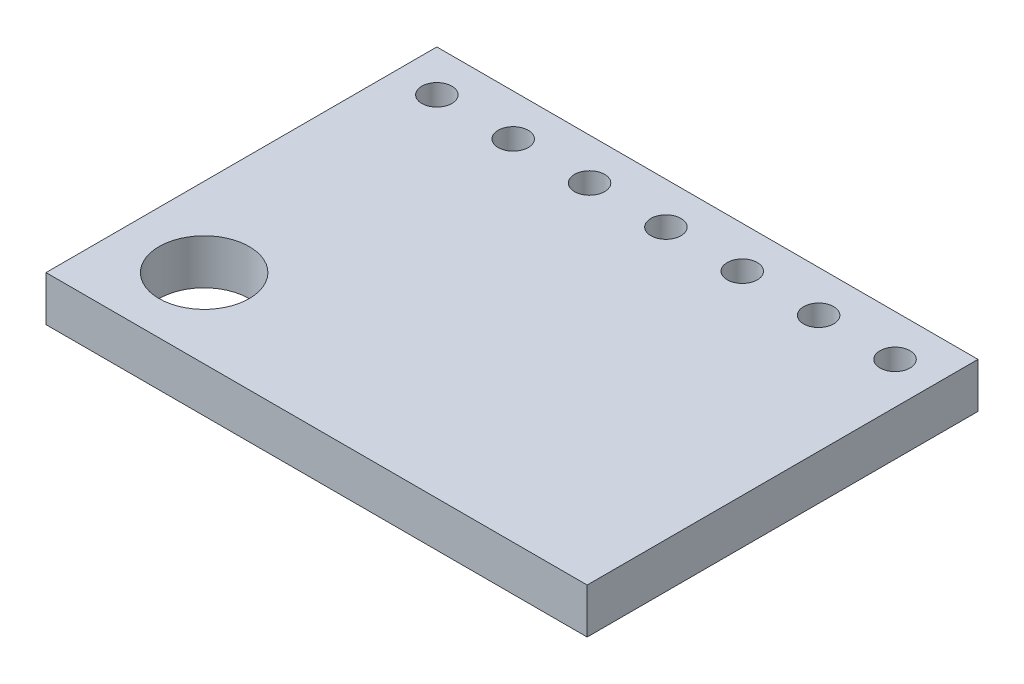
ISO-10303-21;
HEADER;
FILE_DESCRIPTION(('STEP AP214'),'2;1');
FILE_NAME('part.step','',(''),(''),'','','');
FILE_SCHEMA(('AUTOMOTIVE_DESIGN { 1 0 10303 214 1 1 1 1 }'));
ENDSEC;
DATA;
#1=APPLICATION_CONTEXT('core data for automotive mechanical design processes');
#2=APPLICATION_PROTOCOL_DEFINITION('international standard','automotive_design',2000,#1);
#3=PRODUCT_CONTEXT('',#1,'mechanical');
#4=PRODUCT('Part','Part','',(#3));
#5=PRODUCT_RELATED_PRODUCT_CATEGORY('part','',(#4));
#6=PRODUCT_DEFINITION_FORMATION('','',#4);
#7=PRODUCT_DEFINITION_CONTEXT('part definition',#1,'design');
#8=PRODUCT_DEFINITION('design','',#6,#7);
#9=PRODUCT_DEFINITION_SHAPE('','',#8);
#10=(LENGTH_UNIT() NAMED_UNIT(*) SI_UNIT(.MILLI.,.METRE.));
#11=(NAMED_UNIT(*) PLANE_ANGLE_UNIT() SI_UNIT($,.RADIAN.));
#12=(NAMED_UNIT(*) SI_UNIT($,.STERADIAN.) SOLID_ANGLE_UNIT());
#13=UNCERTAINTY_MEASURE_WITH_UNIT(LENGTH_MEASURE(1.E-05),#10,'distance_accuracy_value','');
#14=(GEOMETRIC_REPRESENTATION_CONTEXT(3) GLOBAL_UNCERTAINTY_ASSIGNED_CONTEXT((#13)) GLOBAL_UNIT_ASSIGNED_CONTEXT((#10,
#11,#12)) REPRESENTATION_CONTEXT('',''));
#15=CARTESIAN_POINT('',(0.,0.,0.));
#16=DIRECTION('',(0.,0.,1.));
#17=DIRECTION('',(1.,0.,0.));
#18=AXIS2_PLACEMENT_3D('',#15,#16,#17);
#19=CARTESIAN_POINT('',(0.,-1.5,0.));
#20=DIRECTION('',(-1.,0.,0.));
#21=DIRECTION('',(0.,0.,1.));
#22=AXIS2_PLACEMENT_3D('',#19,#20,#21);
#23=PLANE('',#22);
#24=DIRECTION('',(0.,0.,1.));
#25=VECTOR('',#24,1.);
#26=CARTESIAN_POINT('',(0.,0.,0.));
#27=LINE('',#26,#25);
#28=CARTESIAN_POINT('',(0.,0.,0.));
#29=VERTEX_POINT('',#28);
#30=CARTESIAN_POINT('',(0.,0.,13.));
#31=VERTEX_POINT('',#30);
#32=EDGE_CURVE('E99',#29,#31,#27,.T.);
#33=ORIENTED_EDGE('',*,*,#32,.F.);
#34=DIRECTION('',(0.,1.,0.));
#35=VECTOR('',#34,1.);
#36=CARTESIAN_POINT('',(0.,-1.5,0.));
#37=LINE('',#36,#35);
#38=CARTESIAN_POINT('',(0.,-1.5,0.));
#39=VERTEX_POINT('',#38);
#40=EDGE_CURVE('E11',#39,#29,#37,.T.);
#41=ORIENTED_EDGE('',*,*,#40,.F.);
#42=DIRECTION('',(0.,0.,1.));
#43=VECTOR('',#42,1.);
#44=CARTESIAN_POINT('',(0.,-1.5,0.));
#45=LINE('',#44,#43);
#46=CARTESIAN_POINT('',(0.,-1.5,13.));
#47=VERTEX_POINT('',#46);
#48=EDGE_CURVE('E92',#39,#47,#45,.T.);
#49=ORIENTED_EDGE('',*,*,#48,.T.);
#50=DIRECTION('',(0.,1.,0.));
#51=VECTOR('',#50,1.);
#52=CARTESIAN_POINT('',(0.,-1.5,13.));
#53=LINE('',#52,#51);
#54=EDGE_CURVE('E37',#47,#31,#53,.T.);
#55=ORIENTED_EDGE('',*,*,#54,.T.);
#56=EDGE_LOOP('',(#33,#41,#49,#55));
#57=FACE_BOUND('',#56,.T.);
#58=ADVANCED_FACE('F34',(#57),#23,.T.);
#59=CARTESIAN_POINT('',(0.,-1.5,0.));
#60=DIRECTION('',(0.,0.,-1.));
#61=DIRECTION('',(-1.,0.,0.));
#62=AXIS2_PLACEMENT_3D('',#59,#60,#61);
#63=PLANE('',#62);
#64=DIRECTION('',(-1.,0.,0.));
#65=VECTOR('',#64,1.);
#66=CARTESIAN_POINT('',(0.,0.,0.));
#67=LINE('',#66,#65);
#68=CARTESIAN_POINT('',(18.,0.,0.));
#69=VERTEX_POINT('',#68);
#70=EDGE_CURVE('E94',#69,#29,#67,.T.);
#71=ORIENTED_EDGE('',*,*,#70,.F.);
#72=DIRECTION('',(0.,1.,0.));
#73=VECTOR('',#72,1.);
#74=CARTESIAN_POINT('',(18.,-1.5,0.));
#75=LINE('',#74,#73);
#76=CARTESIAN_POINT('',(18.,-1.5,0.));
#77=VERTEX_POINT('',#76);
#78=EDGE_CURVE('E43',#77,#69,#75,.T.);
#79=ORIENTED_EDGE('',*,*,#78,.F.);
#80=DIRECTION('',(-1.,0.,0.));
#81=VECTOR('',#80,1.);
#82=CARTESIAN_POINT('',(0.,-1.5,0.));
#83=LINE('',#82,#81);
#84=EDGE_CURVE('E89',#77,#39,#83,.T.);
#85=ORIENTED_EDGE('',*,*,#84,.T.);
#86=ORIENTED_EDGE('',*,*,#40,.T.);
#87=EDGE_LOOP('',(#71,#79,#85,#86));
#88=FACE_BOUND('',#87,.T.);
#89=ADVANCED_FACE('F110',(#88),#63,.T.);
#90=CARTESIAN_POINT('',(18.,-1.5,0.));
#91=DIRECTION('',(1.,0.,0.));
#92=DIRECTION('',(0.,0.,-1.));
#93=AXIS2_PLACEMENT_3D('',#90,#91,#92);
#94=PLANE('',#93);
#95=DIRECTION('',(0.,0.,-1.));
#96=VECTOR('',#95,1.);
#97=CARTESIAN_POINT('',(18.,0.,0.));
#98=LINE('',#97,#96);
#99=CARTESIAN_POINT('',(18.,0.,13.));
#100=VERTEX_POINT('',#99);
#101=EDGE_CURVE('E84',#100,#69,#98,.T.);
#102=ORIENTED_EDGE('',*,*,#101,.F.);
#103=DIRECTION('',(0.,1.,0.));
#104=VECTOR('',#103,1.);
#105=CARTESIAN_POINT('',(18.,-1.5,13.));
#106=LINE('',#105,#104);
#107=CARTESIAN_POINT('',(18.,-1.5,13.));
#108=VERTEX_POINT('',#107);
#109=EDGE_CURVE('E79',#108,#100,#106,.T.);
#110=ORIENTED_EDGE('',*,*,#109,.F.);
#111=DIRECTION('',(0.,0.,-1.));
#112=VECTOR('',#111,1.);
#113=CARTESIAN_POINT('',(18.,-1.5,0.));
#114=LINE('',#113,#112);
#115=EDGE_CURVE('E82',#108,#77,#114,.T.);
#116=ORIENTED_EDGE('',*,*,#115,.T.);
#117=ORIENTED_EDGE('',*,*,#78,.T.);
#118=EDGE_LOOP('',(#102,#110,#116,#117));
#119=FACE_BOUND('',#118,.T.);
#120=ADVANCED_FACE('F81',(#119),#94,.T.);
#121=CARTESIAN_POINT('',(0.,-1.5,13.));
#122=DIRECTION('',(0.,0.,1.));
#123=DIRECTION('',(1.,0.,0.));
#124=AXIS2_PLACEMENT_3D('',#121,#122,#123);
#125=PLANE('',#124);
#126=DIRECTION('',(1.,0.,0.));
#127=VECTOR('',#126,1.);
#128=CARTESIAN_POINT('',(0.,0.,13.));
#129=LINE('',#128,#127);
#130=EDGE_CURVE('E102',#31,#100,#129,.T.);
#131=ORIENTED_EDGE('',*,*,#130,.F.);
#132=ORIENTED_EDGE('',*,*,#54,.F.);
#133=DIRECTION('',(1.,0.,0.));
#134=VECTOR('',#133,1.);
#135=CARTESIAN_POINT('',(0.,-1.5,13.));
#136=LINE('',#135,#134);
#137=EDGE_CURVE('E88',#47,#108,#136,.T.);
#138=ORIENTED_EDGE('',*,*,#137,.T.);
#139=ORIENTED_EDGE('',*,*,#109,.T.);
#140=EDGE_LOOP('',(#131,#132,#138,#139));
#141=FACE_BOUND('',#140,.T.);
#142=ADVANCED_FACE('F91',(#141),#125,.T.);
#143=CARTESIAN_POINT('',(0.,-1.5,0.));
#144=DIRECTION('',(0.,1.,0.));
#145=DIRECTION('',(0.,0.,1.));
#146=AXIS2_PLACEMENT_3D('',#143,#144,#145);
#147=PLANE('',#146);
#148=CARTESIAN_POINT('',(16.62,-1.5,1.38));
#149=DIRECTION('',(0.,1.,0.));
#150=DIRECTION('',(0.,0.,1.));
#151=AXIS2_PLACEMENT_3D('',#148,#149,#150);
#152=CIRCLE('',#151,0.499999999999999);
#153=CARTESIAN_POINT('',(16.62,-1.5,1.88));
#154=VERTEX_POINT('',#153);
#155=EDGE_CURVE('E167',#154,#154,#152,.T.);
#156=ORIENTED_EDGE('',*,*,#155,.T.);
#157=EDGE_LOOP('',(#156));
#158=FACE_BOUND('',#157,.T.);
#159=CARTESIAN_POINT('',(14.08,-1.5,1.38));
#160=DIRECTION('',(0.,1.,0.));
#161=DIRECTION('',(0.,0.,1.));
#162=AXIS2_PLACEMENT_3D('',#159,#160,#161);
#163=CIRCLE('',#162,0.500000000000001);
#164=CARTESIAN_POINT('',(14.08,-1.5,1.88));
#165=VERTEX_POINT('',#164);
#166=EDGE_CURVE('E175',#165,#165,#163,.T.);
#167=ORIENTED_EDGE('',*,*,#166,.T.);
#168=EDGE_LOOP('',(#167));
#169=FACE_BOUND('',#168,.T.);
#170=CARTESIAN_POINT('',(11.54,-1.5,1.38));
#171=DIRECTION('',(0.,1.,0.));
#172=DIRECTION('',(0.,0.,1.));
#173=AXIS2_PLACEMENT_3D('',#170,#171,#172);
#174=CIRCLE('',#173,0.500000000000001);
#175=CARTESIAN_POINT('',(11.54,-1.5,1.88));
#176=VERTEX_POINT('',#175);
#177=EDGE_CURVE('E181',#176,#176,#174,.T.);
#178=ORIENTED_EDGE('',*,*,#177,.T.);
#179=EDGE_LOOP('',(#178));
#180=FACE_BOUND('',#179,.T.);
#181=CARTESIAN_POINT('',(9.,-1.5,1.38));
#182=DIRECTION('',(0.,1.,0.));
#183=DIRECTION('',(0.,0.,1.));
#184=AXIS2_PLACEMENT_3D('',#181,#182,#183);
#185=CIRCLE('',#184,0.500000000000001);
#186=CARTESIAN_POINT('',(9.,-1.5,1.88));
#187=VERTEX_POINT('',#186);
#188=EDGE_CURVE('E187',#187,#187,#185,.T.);
#189=ORIENTED_EDGE('',*,*,#188,.T.);
#190=EDGE_LOOP('',(#189));
#191=FACE_BOUND('',#190,.T.);
#192=CARTESIAN_POINT('',(6.46,-1.5,1.38));
#193=DIRECTION('',(0.,1.,0.));
#194=DIRECTION('',(0.,0.,1.));
#195=AXIS2_PLACEMENT_3D('',#192,#193,#194);
#196=CIRCLE('',#195,0.5);
#197=CARTESIAN_POINT('',(6.46,-1.5,1.88));
#198=VERTEX_POINT('',#197);
#199=EDGE_CURVE('E193',#198,#198,#196,.T.);
#200=ORIENTED_EDGE('',*,*,#199,.T.);
#201=EDGE_LOOP('',(#200));
#202=FACE_BOUND('',#201,.T.);
#203=CARTESIAN_POINT('',(3.92,-1.5,1.38));
#204=DIRECTION('',(0.,1.,0.));
#205=DIRECTION('',(0.,0.,1.));
#206=AXIS2_PLACEMENT_3D('',#203,#204,#205);
#207=CIRCLE('',#206,0.500000000000001);
#208=CARTESIAN_POINT('',(3.92,-1.5,1.88));
#209=VERTEX_POINT('',#208);
#210=EDGE_CURVE('E199',#209,#209,#207,.T.);
#211=ORIENTED_EDGE('',*,*,#210,.T.);
#212=EDGE_LOOP('',(#211));
#213=FACE_BOUND('',#212,.T.);
#214=CARTESIAN_POINT('',(2.63,-1.5,10.37));
#215=DIRECTION('',(0.,1.,0.));
#216=DIRECTION('',(0.,0.,1.));
#217=AXIS2_PLACEMENT_3D('',#214,#215,#216);
#218=CIRCLE('',#217,1.5);
#219=CARTESIAN_POINT('',(2.63,-1.5,11.87));
#220=VERTEX_POINT('',#219);
#221=EDGE_CURVE('E205',#220,#220,#218,.T.);
#222=ORIENTED_EDGE('',*,*,#221,.T.);
#223=EDGE_LOOP('',(#222));
#224=FACE_BOUND('',#223,.T.);
#225=CARTESIAN_POINT('',(1.38,-1.5,1.38));
#226=DIRECTION('',(0.,1.,0.));
#227=DIRECTION('',(0.,0.,1.));
#228=AXIS2_PLACEMENT_3D('',#225,#226,#227);
#229=CIRCLE('',#228,0.5);
#230=CARTESIAN_POINT('',(1.38,-1.5,1.88));
#231=VERTEX_POINT('',#230);
#232=EDGE_CURVE('E103',#231,#231,#229,.T.);
#233=ORIENTED_EDGE('',*,*,#232,.T.);
#234=EDGE_LOOP('',(#233));
#235=FACE_BOUND('',#234,.T.);
#236=ORIENTED_EDGE('',*,*,#48,.F.);
#237=ORIENTED_EDGE('',*,*,#84,.F.);
#238=ORIENTED_EDGE('',*,*,#115,.F.);
#239=ORIENTED_EDGE('',*,*,#137,.F.);
#240=EDGE_LOOP('',(#236,#237,#238,#239));
#241=FACE_BOUND('',#240,.T.);
#242=ADVANCED_FACE('F87',(#158,#169,#180,#191,#202,#213,#224,#235,#241),#147,.F.);
#243=CARTESIAN_POINT('',(0.,0.,0.));
#244=DIRECTION('',(0.,1.,0.));
#245=DIRECTION('',(0.,0.,1.));
#246=AXIS2_PLACEMENT_3D('',#243,#244,#245);
#247=PLANE('',#246);
#248=CARTESIAN_POINT('',(16.62,0.,1.38));
#249=DIRECTION('',(0.,1.,0.));
#250=DIRECTION('',(0.,0.,1.));
#251=AXIS2_PLACEMENT_3D('',#248,#249,#250);
#252=CIRCLE('',#251,0.499999999999999);
#253=CARTESIAN_POINT('',(16.62,0.,1.88));
#254=VERTEX_POINT('',#253);
#255=EDGE_CURVE('E170',#254,#254,#252,.T.);
#256=ORIENTED_EDGE('',*,*,#255,.F.);
#257=EDGE_LOOP('',(#256));
#258=FACE_BOUND('',#257,.T.);
#259=CARTESIAN_POINT('',(14.08,0.,1.38));
#260=DIRECTION('',(0.,1.,0.));
#261=DIRECTION('',(0.,0.,1.));
#262=AXIS2_PLACEMENT_3D('',#259,#260,#261);
#263=CIRCLE('',#262,0.500000000000001);
#264=CARTESIAN_POINT('',(14.08,0.,1.88));
#265=VERTEX_POINT('',#264);
#266=EDGE_CURVE('E172',#265,#265,#263,.T.);
#267=ORIENTED_EDGE('',*,*,#266,.F.);
#268=EDGE_LOOP('',(#267));
#269=FACE_BOUND('',#268,.T.);
#270=CARTESIAN_POINT('',(11.54,0.,1.38));
#271=DIRECTION('',(0.,1.,0.));
#272=DIRECTION('',(0.,0.,1.));
#273=AXIS2_PLACEMENT_3D('',#270,#271,#272);
#274=CIRCLE('',#273,0.500000000000001);
#275=CARTESIAN_POINT('',(11.54,0.,1.88));
#276=VERTEX_POINT('',#275);
#277=EDGE_CURVE('E178',#276,#276,#274,.T.);
#278=ORIENTED_EDGE('',*,*,#277,.F.);
#279=EDGE_LOOP('',(#278));
#280=FACE_BOUND('',#279,.T.);
#281=CARTESIAN_POINT('',(9.,0.,1.38));
#282=DIRECTION('',(0.,1.,0.));
#283=DIRECTION('',(0.,0.,1.));
#284=AXIS2_PLACEMENT_3D('',#281,#282,#283);
#285=CIRCLE('',#284,0.500000000000001);
#286=CARTESIAN_POINT('',(9.,0.,1.88));
#287=VERTEX_POINT('',#286);
#288=EDGE_CURVE('E184',#287,#287,#285,.T.);
#289=ORIENTED_EDGE('',*,*,#288,.F.);
#290=EDGE_LOOP('',(#289));
#291=FACE_BOUND('',#290,.T.);
#292=CARTESIAN_POINT('',(6.46,0.,1.38));
#293=DIRECTION('',(0.,1.,0.));
#294=DIRECTION('',(0.,0.,1.));
#295=AXIS2_PLACEMENT_3D('',#292,#293,#294);
#296=CIRCLE('',#295,0.5);
#297=CARTESIAN_POINT('',(6.46,0.,1.88));
#298=VERTEX_POINT('',#297);
#299=EDGE_CURVE('E190',#298,#298,#296,.T.);
#300=ORIENTED_EDGE('',*,*,#299,.F.);
#301=EDGE_LOOP('',(#300));
#302=FACE_BOUND('',#301,.T.);
#303=CARTESIAN_POINT('',(3.92,0.,1.38));
#304=DIRECTION('',(0.,1.,0.));
#305=DIRECTION('',(0.,0.,1.));
#306=AXIS2_PLACEMENT_3D('',#303,#304,#305);
#307=CIRCLE('',#306,0.500000000000001);
#308=CARTESIAN_POINT('',(3.92,0.,1.88));
#309=VERTEX_POINT('',#308);
#310=EDGE_CURVE('E196',#309,#309,#307,.T.);
#311=ORIENTED_EDGE('',*,*,#310,.F.);
#312=EDGE_LOOP('',(#311));
#313=FACE_BOUND('',#312,.T.);
#314=CARTESIAN_POINT('',(2.63,0.,10.37));
#315=DIRECTION('',(0.,1.,0.));
#316=DIRECTION('',(0.,0.,1.));
#317=AXIS2_PLACEMENT_3D('',#314,#315,#316);
#318=CIRCLE('',#317,1.5);
#319=CARTESIAN_POINT('',(2.63,0.,11.87));
#320=VERTEX_POINT('',#319);
#321=EDGE_CURVE('E202',#320,#320,#318,.T.);
#322=ORIENTED_EDGE('',*,*,#321,.F.);
#323=EDGE_LOOP('',(#322));
#324=FACE_BOUND('',#323,.T.);
#325=CARTESIAN_POINT('',(1.38,0.,1.38));
#326=DIRECTION('',(0.,1.,0.));
#327=DIRECTION('',(0.,0.,1.));
#328=AXIS2_PLACEMENT_3D('',#325,#326,#327);
#329=CIRCLE('',#328,0.5);
#330=CARTESIAN_POINT('',(1.38,0.,1.88));
#331=VERTEX_POINT('',#330);
#332=EDGE_CURVE('E208',#331,#331,#329,.T.);
#333=ORIENTED_EDGE('',*,*,#332,.F.);
#334=EDGE_LOOP('',(#333));
#335=FACE_BOUND('',#334,.T.);
#336=ORIENTED_EDGE('',*,*,#32,.T.);
#337=ORIENTED_EDGE('',*,*,#130,.T.);
#338=ORIENTED_EDGE('',*,*,#101,.T.);
#339=ORIENTED_EDGE('',*,*,#70,.T.);
#340=EDGE_LOOP('',(#336,#337,#338,#339));
#341=FACE_BOUND('',#340,.T.);
#342=ADVANCED_FACE('F109',(#258,#269,#280,#291,#302,#313,#324,#335,#341),#247,.T.);
#343=CARTESIAN_POINT('',(1.38,-1.5,1.38));
#344=DIRECTION('',(0.,1.,0.));
#345=DIRECTION('',(0.,0.,1.));
#346=AXIS2_PLACEMENT_3D('',#343,#344,#345);
#347=CYLINDRICAL_SURFACE('',#346,0.5);
#348=ORIENTED_EDGE('',*,*,#232,.F.);
#349=EDGE_LOOP('',(#348));
#350=FACE_BOUND('',#349,.T.);
#351=ORIENTED_EDGE('',*,*,#332,.T.);
#352=EDGE_LOOP('',(#351));
#353=FACE_BOUND('',#352,.T.);
#354=ADVANCED_FACE('F128',(#350,#353),#347,.F.);
#355=CARTESIAN_POINT('',(2.63,-1.5,10.37));
#356=DIRECTION('',(0.,1.,0.));
#357=DIRECTION('',(0.,0.,1.));
#358=AXIS2_PLACEMENT_3D('',#355,#356,#357);
#359=CYLINDRICAL_SURFACE('',#358,1.5);
#360=ORIENTED_EDGE('',*,*,#221,.F.);
#361=EDGE_LOOP('',(#360));
#362=FACE_BOUND('',#361,.T.);
#363=ORIENTED_EDGE('',*,*,#321,.T.);
#364=EDGE_LOOP('',(#363));
#365=FACE_BOUND('',#364,.T.);
#366=ADVANCED_FACE('F135',(#362,#365),#359,.F.);
#367=CARTESIAN_POINT('',(3.92,-1.5,1.38));
#368=DIRECTION('',(0.,1.,0.));
#369=DIRECTION('',(0.,0.,1.));
#370=AXIS2_PLACEMENT_3D('',#367,#368,#369);
#371=CYLINDRICAL_SURFACE('',#370,0.500000000000001);
#372=ORIENTED_EDGE('',*,*,#210,.F.);
#373=EDGE_LOOP('',(#372));
#374=FACE_BOUND('',#373,.T.);
#375=ORIENTED_EDGE('',*,*,#310,.T.);
#376=EDGE_LOOP('',(#375));
#377=FACE_BOUND('',#376,.T.);
#378=ADVANCED_FACE('F139',(#374,#377),#371,.F.);
#379=CARTESIAN_POINT('',(6.46,-1.5,1.38));
#380=DIRECTION('',(0.,1.,0.));
#381=DIRECTION('',(0.,0.,1.));
#382=AXIS2_PLACEMENT_3D('',#379,#380,#381);
#383=CYLINDRICAL_SURFACE('',#382,0.5);
#384=ORIENTED_EDGE('',*,*,#199,.F.);
#385=EDGE_LOOP('',(#384));
#386=FACE_BOUND('',#385,.T.);
#387=ORIENTED_EDGE('',*,*,#299,.T.);
#388=EDGE_LOOP('',(#387));
#389=FACE_BOUND('',#388,.T.);
#390=ADVANCED_FACE('F143',(#386,#389),#383,.F.);
#391=CARTESIAN_POINT('',(9.,-1.5,1.38));
#392=DIRECTION('',(0.,1.,0.));
#393=DIRECTION('',(0.,0.,1.));
#394=AXIS2_PLACEMENT_3D('',#391,#392,#393);
#395=CYLINDRICAL_SURFACE('',#394,0.500000000000001);
#396=ORIENTED_EDGE('',*,*,#188,.F.);
#397=EDGE_LOOP('',(#396));
#398=FACE_BOUND('',#397,.T.);
#399=ORIENTED_EDGE('',*,*,#288,.T.);
#400=EDGE_LOOP('',(#399));
#401=FACE_BOUND('',#400,.T.);
#402=ADVANCED_FACE('F147',(#398,#401),#395,.F.);
#403=CARTESIAN_POINT('',(11.54,-1.5,1.38));
#404=DIRECTION('',(0.,1.,0.));
#405=DIRECTION('',(0.,0.,1.));
#406=AXIS2_PLACEMENT_3D('',#403,#404,#405);
#407=CYLINDRICAL_SURFACE('',#406,0.500000000000001);
#408=ORIENTED_EDGE('',*,*,#177,.F.);
#409=EDGE_LOOP('',(#408));
#410=FACE_BOUND('',#409,.T.);
#411=ORIENTED_EDGE('',*,*,#277,.T.);
#412=EDGE_LOOP('',(#411));
#413=FACE_BOUND('',#412,.T.);
#414=ADVANCED_FACE('F151',(#410,#413),#407,.F.);
#415=CARTESIAN_POINT('',(14.08,-1.5,1.38));
#416=DIRECTION('',(0.,1.,0.));
#417=DIRECTION('',(0.,0.,1.));
#418=AXIS2_PLACEMENT_3D('',#415,#416,#417);
#419=CYLINDRICAL_SURFACE('',#418,0.500000000000001);
#420=ORIENTED_EDGE('',*,*,#166,.F.);
#421=EDGE_LOOP('',(#420));
#422=FACE_BOUND('',#421,.T.);
#423=ORIENTED_EDGE('',*,*,#266,.T.);
#424=EDGE_LOOP('',(#423));
#425=FACE_BOUND('',#424,.T.);
#426=ADVANCED_FACE('F155',(#422,#425),#419,.F.);
#427=CARTESIAN_POINT('',(16.62,-1.5,1.38));
#428=DIRECTION('',(0.,1.,0.));
#429=DIRECTION('',(0.,0.,1.));
#430=AXIS2_PLACEMENT_3D('',#427,#428,#429);
#431=CYLINDRICAL_SURFACE('',#430,0.499999999999999);
#432=ORIENTED_EDGE('',*,*,#155,.F.);
#433=EDGE_LOOP('',(#432));
#434=FACE_BOUND('',#433,.T.);
#435=ORIENTED_EDGE('',*,*,#255,.T.);
#436=EDGE_LOOP('',(#435));
#437=FACE_BOUND('',#436,.T.);
#438=ADVANCED_FACE('F159',(#434,#437),#431,.F.);
#439=CLOSED_SHELL('',(#58,#89,#120,#142,#242,#342,#354,#366,#378,#390,#402,#414,#426,#438));
#440=MANIFOLD_SOLID_BREP('B2',#439);
#441=ADVANCED_BREP_SHAPE_REPRESENTATION('',(#18,#440),#14);
#442=SHAPE_DEFINITION_REPRESENTATION(#9,#441);
ENDSEC;
END-ISO-10303-21;
